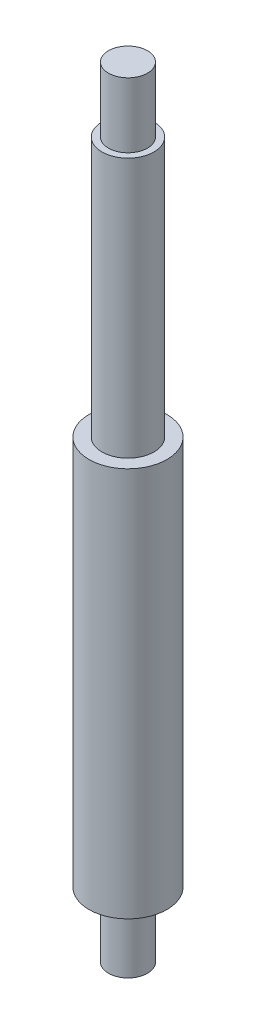
ISO-10303-21;
HEADER;
FILE_DESCRIPTION(('STEP AP214'),'2;1');
FILE_NAME('part.step','',(''),(''),'','','');
FILE_SCHEMA(('AUTOMOTIVE_DESIGN { 1 0 10303 214 1 1 1 1 }'));
ENDSEC;
DATA;
#1=APPLICATION_CONTEXT('core data for automotive mechanical design processes');
#2=APPLICATION_PROTOCOL_DEFINITION('international standard','automotive_design',2000,#1);
#3=PRODUCT_CONTEXT('',#1,'mechanical');
#4=PRODUCT('Part','Part','',(#3));
#5=PRODUCT_RELATED_PRODUCT_CATEGORY('part','',(#4));
#6=PRODUCT_DEFINITION_FORMATION('','',#4);
#7=PRODUCT_DEFINITION_CONTEXT('part definition',#1,'design');
#8=PRODUCT_DEFINITION('design','',#6,#7);
#9=PRODUCT_DEFINITION_SHAPE('','',#8);
#10=(LENGTH_UNIT() NAMED_UNIT(*) SI_UNIT(.MILLI.,.METRE.));
#11=(NAMED_UNIT(*) PLANE_ANGLE_UNIT() SI_UNIT($,.RADIAN.));
#12=(NAMED_UNIT(*) SI_UNIT($,.STERADIAN.) SOLID_ANGLE_UNIT());
#13=UNCERTAINTY_MEASURE_WITH_UNIT(LENGTH_MEASURE(1.E-05),#10,'distance_accuracy_value','');
#14=(GEOMETRIC_REPRESENTATION_CONTEXT(3) GLOBAL_UNCERTAINTY_ASSIGNED_CONTEXT((#13)) GLOBAL_UNIT_ASSIGNED_CONTEXT((#10,
#11,#12)) REPRESENTATION_CONTEXT('',''));
#15=CARTESIAN_POINT('',(0.,0.,0.));
#16=DIRECTION('',(0.,0.,1.));
#17=DIRECTION('',(1.,0.,0.));
#18=AXIS2_PLACEMENT_3D('',#15,#16,#17);
#19=CARTESIAN_POINT('',(0.,110.,0.));
#20=DIRECTION('',(0.,1.,0.));
#21=DIRECTION('',(0.,0.,1.));
#22=AXIS2_PLACEMENT_3D('',#19,#20,#21);
#23=PLANE('',#22);
#24=CARTESIAN_POINT('',(0.,110.,0.));
#25=DIRECTION('',(0.,1.,0.));
#26=DIRECTION('',(0.,0.,1.));
#27=AXIS2_PLACEMENT_3D('',#24,#25,#26);
#28=CIRCLE('',#27,4.);
#29=CARTESIAN_POINT('',(0.,110.,4.));
#30=VERTEX_POINT('',#29);
#31=EDGE_CURVE('E49',#30,#30,#28,.T.);
#32=ORIENTED_EDGE('',*,*,#31,.T.);
#33=EDGE_LOOP('',(#32));
#34=FACE_BOUND('',#33,.T.);
#35=CARTESIAN_POINT('',(0.,110.,0.));
#36=DIRECTION('',(0.,1.,0.));
#37=DIRECTION('',(0.,0.,1.));
#38=AXIS2_PLACEMENT_3D('',#35,#36,#37);
#39=CIRCLE('',#38,3.);
#40=CARTESIAN_POINT('',(0.,110.,3.));
#41=VERTEX_POINT('',#40);
#42=EDGE_CURVE('E58',#41,#41,#39,.T.);
#43=ORIENTED_EDGE('',*,*,#42,.F.);
#44=EDGE_LOOP('',(#43));
#45=FACE_BOUND('',#44,.T.);
#46=ADVANCED_FACE('F33',(#34,#45),#23,.T.);
#47=CARTESIAN_POINT('',(0.,70.,0.));
#48=DIRECTION('',(0.,1.,0.));
#49=DIRECTION('',(0.,0.,1.));
#50=AXIS2_PLACEMENT_3D('',#47,#48,#49);
#51=PLANE('',#50);
#52=CARTESIAN_POINT('',(0.,70.,0.));
#53=DIRECTION('',(0.,1.,0.));
#54=DIRECTION('',(0.,0.,1.));
#55=AXIS2_PLACEMENT_3D('',#52,#53,#54);
#56=CIRCLE('',#55,6.);
#57=CARTESIAN_POINT('',(0.,70.,6.));
#58=VERTEX_POINT('',#57);
#59=EDGE_CURVE('E44',#58,#58,#56,.T.);
#60=ORIENTED_EDGE('',*,*,#59,.T.);
#61=EDGE_LOOP('',(#60));
#62=FACE_BOUND('',#61,.T.);
#63=CARTESIAN_POINT('',(0.,70.,0.));
#64=DIRECTION('',(0.,1.,0.));
#65=DIRECTION('',(0.,0.,1.));
#66=AXIS2_PLACEMENT_3D('',#63,#64,#65);
#67=CIRCLE('',#66,4.);
#68=CARTESIAN_POINT('',(0.,70.,4.));
#69=VERTEX_POINT('',#68);
#70=EDGE_CURVE('E52',#69,#69,#67,.T.);
#71=ORIENTED_EDGE('',*,*,#70,.F.);
#72=EDGE_LOOP('',(#71));
#73=FACE_BOUND('',#72,.T.);
#74=ADVANCED_FACE('F74',(#62,#73),#51,.T.);
#75=CARTESIAN_POINT('',(0.,10.,0.));
#76=DIRECTION('',(0.,-1.,0.));
#77=DIRECTION('',(0.,0.,-1.));
#78=AXIS2_PLACEMENT_3D('',#75,#76,#77);
#79=CYLINDRICAL_SURFACE('',#78,3.);
#80=CARTESIAN_POINT('',(0.,10.,0.));
#81=DIRECTION('',(0.,1.,0.));
#82=DIRECTION('',(0.,0.,1.));
#83=AXIS2_PLACEMENT_3D('',#80,#81,#82);
#84=CIRCLE('',#83,3.);
#85=CARTESIAN_POINT('',(0.,10.,3.));
#86=VERTEX_POINT('',#85);
#87=EDGE_CURVE('E10',#86,#86,#84,.T.);
#88=ORIENTED_EDGE('',*,*,#87,.F.);
#89=EDGE_LOOP('',(#88));
#90=FACE_BOUND('',#89,.T.);
#91=CARTESIAN_POINT('',(0.,0.,0.));
#92=DIRECTION('',(0.,1.,0.));
#93=DIRECTION('',(0.,0.,1.));
#94=AXIS2_PLACEMENT_3D('',#91,#92,#93);
#95=CIRCLE('',#94,3.);
#96=CARTESIAN_POINT('',(0.,0.,3.));
#97=VERTEX_POINT('',#96);
#98=EDGE_CURVE('E37',#97,#97,#95,.T.);
#99=ORIENTED_EDGE('',*,*,#98,.T.);
#100=EDGE_LOOP('',(#99));
#101=FACE_BOUND('',#100,.T.);
#102=ADVANCED_FACE('F35',(#90,#101),#79,.T.);
#103=CARTESIAN_POINT('',(0.,0.,0.));
#104=DIRECTION('',(0.,1.,0.));
#105=DIRECTION('',(0.,0.,1.));
#106=AXIS2_PLACEMENT_3D('',#103,#104,#105);
#107=PLANE('',#106);
#108=ORIENTED_EDGE('',*,*,#98,.F.);
#109=EDGE_LOOP('',(#108));
#110=FACE_BOUND('',#109,.T.);
#111=ADVANCED_FACE('F91',(#110),#107,.F.);
#112=CARTESIAN_POINT('',(0.,10.,0.));
#113=DIRECTION('',(0.,1.,0.));
#114=DIRECTION('',(0.,0.,1.));
#115=AXIS2_PLACEMENT_3D('',#112,#113,#114);
#116=PLANE('',#115);
#117=CARTESIAN_POINT('',(0.,10.,0.));
#118=DIRECTION('',(0.,1.,0.));
#119=DIRECTION('',(0.,0.,1.));
#120=AXIS2_PLACEMENT_3D('',#117,#118,#119);
#121=CIRCLE('',#120,6.);
#122=CARTESIAN_POINT('',(0.,10.,6.));
#123=VERTEX_POINT('',#122);
#124=EDGE_CURVE('E46',#123,#123,#121,.T.);
#125=ORIENTED_EDGE('',*,*,#124,.F.);
#126=EDGE_LOOP('',(#125));
#127=FACE_BOUND('',#126,.T.);
#128=ORIENTED_EDGE('',*,*,#87,.T.);
#129=EDGE_LOOP('',(#128));
#130=FACE_BOUND('',#129,.T.);
#131=ADVANCED_FACE('F88',(#127,#130),#116,.F.);
#132=CARTESIAN_POINT('',(0.,70.,0.));
#133=DIRECTION('',(0.,-1.,0.));
#134=DIRECTION('',(0.,0.,-1.));
#135=AXIS2_PLACEMENT_3D('',#132,#133,#134);
#136=CYLINDRICAL_SURFACE('',#135,6.);
#137=ORIENTED_EDGE('',*,*,#59,.F.);
#138=EDGE_LOOP('',(#137));
#139=FACE_BOUND('',#138,.T.);
#140=ORIENTED_EDGE('',*,*,#124,.T.);
#141=EDGE_LOOP('',(#140));
#142=FACE_BOUND('',#141,.T.);
#143=ADVANCED_FACE('F85',(#139,#142),#136,.T.);
#144=CARTESIAN_POINT('',(0.,110.,0.));
#145=DIRECTION('',(0.,-1.,0.));
#146=DIRECTION('',(0.,0.,-1.));
#147=AXIS2_PLACEMENT_3D('',#144,#145,#146);
#148=CYLINDRICAL_SURFACE('',#147,4.);
#149=ORIENTED_EDGE('',*,*,#31,.F.);
#150=EDGE_LOOP('',(#149));
#151=FACE_BOUND('',#150,.T.);
#152=ORIENTED_EDGE('',*,*,#70,.T.);
#153=EDGE_LOOP('',(#152));
#154=FACE_BOUND('',#153,.T.);
#155=ADVANCED_FACE('F69',(#151,#154),#148,.T.);
#156=CARTESIAN_POINT('',(0.,120.,0.));
#157=DIRECTION('',(0.,-1.,0.));
#158=DIRECTION('',(0.,0.,-1.));
#159=AXIS2_PLACEMENT_3D('',#156,#157,#158);
#160=CYLINDRICAL_SURFACE('',#159,3.);
#161=CARTESIAN_POINT('',(0.,120.,0.));
#162=DIRECTION('',(0.,1.,0.));
#163=DIRECTION('',(0.,0.,1.));
#164=AXIS2_PLACEMENT_3D('',#161,#162,#163);
#165=CIRCLE('',#164,3.);
#166=CARTESIAN_POINT('',(0.,120.,3.));
#167=VERTEX_POINT('',#166);
#168=EDGE_CURVE('E55',#167,#167,#165,.T.);
#169=ORIENTED_EDGE('',*,*,#168,.F.);
#170=EDGE_LOOP('',(#169));
#171=FACE_BOUND('',#170,.T.);
#172=ORIENTED_EDGE('',*,*,#42,.T.);
#173=EDGE_LOOP('',(#172));
#174=FACE_BOUND('',#173,.T.);
#175=ADVANCED_FACE('F66',(#171,#174),#160,.T.);
#176=CARTESIAN_POINT('',(0.,120.,0.));
#177=DIRECTION('',(0.,1.,0.));
#178=DIRECTION('',(0.,0.,1.));
#179=AXIS2_PLACEMENT_3D('',#176,#177,#178);
#180=PLANE('',#179);
#181=ORIENTED_EDGE('',*,*,#168,.T.);
#182=EDGE_LOOP('',(#181));
#183=FACE_BOUND('',#182,.T.);
#184=ADVANCED_FACE('F64',(#183),#180,.T.);
#185=CLOSED_SHELL('',(#46,#74,#102,#111,#131,#143,#155,#175,#184));
#186=MANIFOLD_SOLID_BREP('B2',#185);
#187=ADVANCED_BREP_SHAPE_REPRESENTATION('',(#18,#186),#14);
#188=SHAPE_DEFINITION_REPRESENTATION(#9,#187);
ENDSEC;
END-ISO-10303-21;
